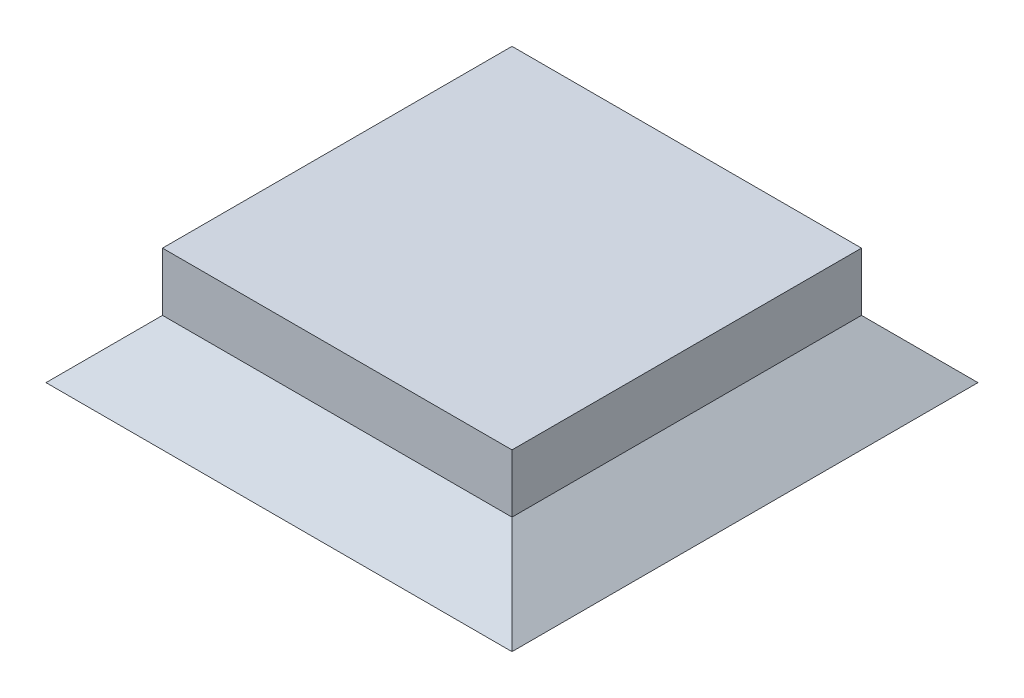
ISO-10303-21;
HEADER;
FILE_DESCRIPTION(('STEP AP214'),'2;1');
FILE_NAME('part.step','',(''),(''),'','','');
FILE_SCHEMA(('AUTOMOTIVE_DESIGN { 1 0 10303 214 1 1 1 1 }'));
ENDSEC;
DATA;
#1=APPLICATION_CONTEXT('core data for automotive mechanical design processes');
#2=APPLICATION_PROTOCOL_DEFINITION('international standard','automotive_design',2000,#1);
#3=PRODUCT_CONTEXT('',#1,'mechanical');
#4=PRODUCT('Part','Part','',(#3));
#5=PRODUCT_RELATED_PRODUCT_CATEGORY('part','',(#4));
#6=PRODUCT_DEFINITION_FORMATION('','',#4);
#7=PRODUCT_DEFINITION_CONTEXT('part definition',#1,'design');
#8=PRODUCT_DEFINITION('design','',#6,#7);
#9=PRODUCT_DEFINITION_SHAPE('','',#8);
#10=(LENGTH_UNIT() NAMED_UNIT(*) SI_UNIT(.MILLI.,.METRE.));
#11=(NAMED_UNIT(*) PLANE_ANGLE_UNIT() SI_UNIT($,.RADIAN.));
#12=(NAMED_UNIT(*) SI_UNIT($,.STERADIAN.) SOLID_ANGLE_UNIT());
#13=UNCERTAINTY_MEASURE_WITH_UNIT(LENGTH_MEASURE(1.E-05),#10,'distance_accuracy_value','');
#14=(GEOMETRIC_REPRESENTATION_CONTEXT(3) GLOBAL_UNCERTAINTY_ASSIGNED_CONTEXT((#13)) GLOBAL_UNIT_ASSIGNED_CONTEXT((#10,
#11,#12)) REPRESENTATION_CONTEXT('',''));
#15=CARTESIAN_POINT('',(0.,0.,0.));
#16=DIRECTION('',(0.,0.,1.));
#17=DIRECTION('',(1.,0.,0.));
#18=AXIS2_PLACEMENT_3D('',#15,#16,#17);
#19=CARTESIAN_POINT('',(3.,2.,-3.));
#20=DIRECTION('',(-1.,0.,0.));
#21=DIRECTION('',(0.,0.,1.));
#22=AXIS2_PLACEMENT_3D('',#19,#20,#21);
#23=PLANE('',#22);
#24=DIRECTION('',(0.,-1.,0.));
#25=VECTOR('',#24,1.);
#26=CARTESIAN_POINT('',(3.,2.,3.));
#27=LINE('',#26,#25);
#28=CARTESIAN_POINT('',(3.,2.,3.));
#29=VERTEX_POINT('',#28);
#30=CARTESIAN_POINT('',(3.,1.,3.));
#31=VERTEX_POINT('',#30);
#32=EDGE_CURVE('E134',#29,#31,#27,.T.);
#33=ORIENTED_EDGE('',*,*,#32,.T.);
#34=DIRECTION('',(0.,0.,-1.));
#35=VECTOR('',#34,1.);
#36=CARTESIAN_POINT('',(3.,1.,-3.));
#37=LINE('',#36,#35);
#38=CARTESIAN_POINT('',(3.,1.,-3.));
#39=VERTEX_POINT('',#38);
#40=EDGE_CURVE('E125',#31,#39,#37,.T.);
#41=ORIENTED_EDGE('',*,*,#40,.T.);
#42=DIRECTION('',(0.,-1.,0.));
#43=VECTOR('',#42,1.);
#44=CARTESIAN_POINT('',(3.,2.,-3.));
#45=LINE('',#44,#43);
#46=CARTESIAN_POINT('',(3.,2.,-3.));
#47=VERTEX_POINT('',#46);
#48=EDGE_CURVE('E47',#47,#39,#45,.T.);
#49=ORIENTED_EDGE('',*,*,#48,.F.);
#50=DIRECTION('',(0.,0.,-1.));
#51=VECTOR('',#50,1.);
#52=CARTESIAN_POINT('',(3.,2.,-3.));
#53=LINE('',#52,#51);
#54=EDGE_CURVE('E127',#29,#47,#53,.T.);
#55=ORIENTED_EDGE('',*,*,#54,.F.);
#56=EDGE_LOOP('',(#33,#41,#49,#55));
#57=FACE_BOUND('',#56,.T.);
#58=ADVANCED_FACE('F37',(#57),#23,.F.);
#59=CARTESIAN_POINT('',(-3.,2.,-3.));
#60=DIRECTION('',(0.,0.,1.));
#61=DIRECTION('',(1.,0.,0.));
#62=AXIS2_PLACEMENT_3D('',#59,#60,#61);
#63=PLANE('',#62);
#64=ORIENTED_EDGE('',*,*,#48,.T.);
#65=DIRECTION('',(-1.,0.,0.));
#66=VECTOR('',#65,1.);
#67=CARTESIAN_POINT('',(-3.,1.,-3.));
#68=LINE('',#67,#66);
#69=CARTESIAN_POINT('',(-3.,1.,-3.));
#70=VERTEX_POINT('',#69);
#71=EDGE_CURVE('E101',#39,#70,#68,.T.);
#72=ORIENTED_EDGE('',*,*,#71,.T.);
#73=DIRECTION('',(0.,-1.,0.));
#74=VECTOR('',#73,1.);
#75=CARTESIAN_POINT('',(-3.,2.,-3.));
#76=LINE('',#75,#74);
#77=CARTESIAN_POINT('',(-3.,2.,-3.));
#78=VERTEX_POINT('',#77);
#79=EDGE_CURVE('E138',#78,#70,#76,.T.);
#80=ORIENTED_EDGE('',*,*,#79,.F.);
#81=DIRECTION('',(-1.,0.,0.));
#82=VECTOR('',#81,1.);
#83=CARTESIAN_POINT('',(-3.,2.,-3.));
#84=LINE('',#83,#82);
#85=EDGE_CURVE('E129',#47,#78,#84,.T.);
#86=ORIENTED_EDGE('',*,*,#85,.F.);
#87=EDGE_LOOP('',(#64,#72,#80,#86));
#88=FACE_BOUND('',#87,.T.);
#89=ADVANCED_FACE('F153',(#88),#63,.F.);
#90=CARTESIAN_POINT('',(-3.,2.,-3.));
#91=DIRECTION('',(1.,0.,0.));
#92=DIRECTION('',(0.,0.,-1.));
#93=AXIS2_PLACEMENT_3D('',#90,#91,#92);
#94=PLANE('',#93);
#95=ORIENTED_EDGE('',*,*,#79,.T.);
#96=DIRECTION('',(0.,0.,1.));
#97=VECTOR('',#96,1.);
#98=CARTESIAN_POINT('',(-3.,1.,-3.));
#99=LINE('',#98,#97);
#100=CARTESIAN_POINT('',(-3.,1.,3.));
#101=VERTEX_POINT('',#100);
#102=EDGE_CURVE('E122',#70,#101,#99,.T.);
#103=ORIENTED_EDGE('',*,*,#102,.T.);
#104=DIRECTION('',(0.,-1.,0.));
#105=VECTOR('',#104,1.);
#106=CARTESIAN_POINT('',(-3.,2.,3.));
#107=LINE('',#106,#105);
#108=CARTESIAN_POINT('',(-3.,2.,3.));
#109=VERTEX_POINT('',#108);
#110=EDGE_CURVE('E136',#109,#101,#107,.T.);
#111=ORIENTED_EDGE('',*,*,#110,.F.);
#112=DIRECTION('',(0.,0.,1.));
#113=VECTOR('',#112,1.);
#114=CARTESIAN_POINT('',(-3.,2.,-3.));
#115=LINE('',#114,#113);
#116=EDGE_CURVE('E131',#78,#109,#115,.T.);
#117=ORIENTED_EDGE('',*,*,#116,.F.);
#118=EDGE_LOOP('',(#95,#103,#111,#117));
#119=FACE_BOUND('',#118,.T.);
#120=ADVANCED_FACE('F165',(#119),#94,.F.);
#121=CARTESIAN_POINT('',(-3.,2.,3.));
#122=DIRECTION('',(0.,0.,-1.));
#123=DIRECTION('',(-1.,0.,0.));
#124=AXIS2_PLACEMENT_3D('',#121,#122,#123);
#125=PLANE('',#124);
#126=ORIENTED_EDGE('',*,*,#110,.T.);
#127=DIRECTION('',(1.,0.,0.));
#128=VECTOR('',#127,1.);
#129=CARTESIAN_POINT('',(-3.,1.,3.));
#130=LINE('',#129,#128);
#131=EDGE_CURVE('E11',#101,#31,#130,.T.);
#132=ORIENTED_EDGE('',*,*,#131,.T.);
#133=ORIENTED_EDGE('',*,*,#32,.F.);
#134=DIRECTION('',(1.,0.,0.));
#135=VECTOR('',#134,1.);
#136=CARTESIAN_POINT('',(-3.,2.,3.));
#137=LINE('',#136,#135);
#138=EDGE_CURVE('E61',#109,#29,#137,.T.);
#139=ORIENTED_EDGE('',*,*,#138,.F.);
#140=EDGE_LOOP('',(#126,#132,#133,#139));
#141=FACE_BOUND('',#140,.T.);
#142=ADVANCED_FACE('F158',(#141),#125,.F.);
#143=CARTESIAN_POINT('',(0.,2.,0.));
#144=DIRECTION('',(0.,1.,0.));
#145=DIRECTION('',(0.,0.,1.));
#146=AXIS2_PLACEMENT_3D('',#143,#144,#145);
#147=PLANE('',#146);
#148=ORIENTED_EDGE('',*,*,#54,.T.);
#149=ORIENTED_EDGE('',*,*,#85,.T.);
#150=ORIENTED_EDGE('',*,*,#116,.T.);
#151=ORIENTED_EDGE('',*,*,#138,.T.);
#152=EDGE_LOOP('',(#148,#149,#150,#151));
#153=FACE_BOUND('',#152,.T.);
#154=ADVANCED_FACE('F156',(#153),#147,.T.);
#155=CARTESIAN_POINT('',(0.,0.,0.));
#156=DIRECTION('',(0.,1.,0.));
#157=DIRECTION('',(0.,0.,1.));
#158=AXIS2_PLACEMENT_3D('',#155,#156,#157);
#159=PLANE('',#158);
#160=DIRECTION('',(0.,0.,-1.));
#161=VECTOR('',#160,1.);
#162=CARTESIAN_POINT('',(4.,0.,-4.));
#163=LINE('',#162,#161);
#164=CARTESIAN_POINT('',(4.,0.,4.));
#165=VERTEX_POINT('',#164);
#166=CARTESIAN_POINT('',(4.,0.,-4.));
#167=VERTEX_POINT('',#166);
#168=EDGE_CURVE('E108',#165,#167,#163,.T.);
#169=ORIENTED_EDGE('',*,*,#168,.F.);
#170=DIRECTION('',(1.,0.,0.));
#171=VECTOR('',#170,1.);
#172=CARTESIAN_POINT('',(-4.,0.,4.));
#173=LINE('',#172,#171);
#174=CARTESIAN_POINT('',(-4.,0.,4.));
#175=VERTEX_POINT('',#174);
#176=EDGE_CURVE('E118',#175,#165,#173,.T.);
#177=ORIENTED_EDGE('',*,*,#176,.F.);
#178=DIRECTION('',(0.,0.,1.));
#179=VECTOR('',#178,1.);
#180=CARTESIAN_POINT('',(-4.,0.,-4.));
#181=LINE('',#180,#179);
#182=CARTESIAN_POINT('',(-4.,0.,-4.));
#183=VERTEX_POINT('',#182);
#184=EDGE_CURVE('E116',#183,#175,#181,.T.);
#185=ORIENTED_EDGE('',*,*,#184,.F.);
#186=DIRECTION('',(-1.,0.,0.));
#187=VECTOR('',#186,1.);
#188=CARTESIAN_POINT('',(-4.,0.,-4.));
#189=LINE('',#188,#187);
#190=EDGE_CURVE('E98',#167,#183,#189,.T.);
#191=ORIENTED_EDGE('',*,*,#190,.F.);
#192=EDGE_LOOP('',(#169,#177,#185,#191));
#193=FACE_BOUND('',#192,.T.);
#194=ADVANCED_FACE('F114',(#193),#159,.F.);
#195=CARTESIAN_POINT('',(0.,1.,3.));
#196=DIRECTION('',(0.,0.707106781186546,0.707106781186549));
#197=DIRECTION('',(-1.,0.,0.));
#198=AXIS2_PLACEMENT_3D('',#195,#196,#197);
#199=PLANE('',#198);
#200=DIRECTION('',(0.577350269189625,0.577350269189627,-0.577350269189625));
#201=VECTOR('',#200,1.);
#202=CARTESIAN_POINT('',(-2.,2.,2.));
#203=LINE('',#202,#201);
#204=EDGE_CURVE('E104',#175,#101,#203,.T.);
#205=ORIENTED_EDGE('',*,*,#204,.F.);
#206=ORIENTED_EDGE('',*,*,#176,.T.);
#207=DIRECTION('',(-0.577350269189625,0.577350269189627,-0.577350269189625));
#208=VECTOR('',#207,1.);
#209=CARTESIAN_POINT('',(2.,2.,2.));
#210=LINE('',#209,#208);
#211=EDGE_CURVE('E42',#31,#165,#210,.F.);
#212=ORIENTED_EDGE('',*,*,#211,.F.);
#213=ORIENTED_EDGE('',*,*,#131,.F.);
#214=EDGE_LOOP('',(#205,#206,#212,#213));
#215=FACE_BOUND('',#214,.T.);
#216=ADVANCED_FACE('F40',(#215),#199,.T.);
#217=CARTESIAN_POINT('',(3.,1.,0.));
#218=DIRECTION('',(0.707106781186549,0.707106781186546,0.));
#219=DIRECTION('',(0.,0.,1.));
#220=AXIS2_PLACEMENT_3D('',#217,#218,#219);
#221=PLANE('',#220);
#222=ORIENTED_EDGE('',*,*,#211,.T.);
#223=ORIENTED_EDGE('',*,*,#168,.T.);
#224=DIRECTION('',(-0.577350269189625,0.577350269189627,0.577350269189625));
#225=VECTOR('',#224,1.);
#226=CARTESIAN_POINT('',(2.,2.,-2.));
#227=LINE('',#226,#225);
#228=EDGE_CURVE('E94',#39,#167,#227,.F.);
#229=ORIENTED_EDGE('',*,*,#228,.F.);
#230=ORIENTED_EDGE('',*,*,#40,.F.);
#231=EDGE_LOOP('',(#222,#223,#229,#230));
#232=FACE_BOUND('',#231,.T.);
#233=ADVANCED_FACE('F109',(#232),#221,.T.);
#234=CARTESIAN_POINT('',(-3.,1.,0.));
#235=DIRECTION('',(-0.707106781186549,0.707106781186546,0.));
#236=DIRECTION('',(0.,0.,-1.));
#237=AXIS2_PLACEMENT_3D('',#234,#235,#236);
#238=PLANE('',#237);
#239=ORIENTED_EDGE('',*,*,#204,.T.);
#240=ORIENTED_EDGE('',*,*,#102,.F.);
#241=DIRECTION('',(-0.577350269189625,-0.577350269189627,-0.577350269189625));
#242=VECTOR('',#241,1.);
#243=CARTESIAN_POINT('',(-2.,2.,-2.));
#244=LINE('',#243,#242);
#245=EDGE_CURVE('E105',#183,#70,#244,.F.);
#246=ORIENTED_EDGE('',*,*,#245,.F.);
#247=ORIENTED_EDGE('',*,*,#184,.T.);
#248=EDGE_LOOP('',(#239,#240,#246,#247));
#249=FACE_BOUND('',#248,.T.);
#250=ADVANCED_FACE('F147',(#249),#238,.T.);
#251=CARTESIAN_POINT('',(0.,1.,-3.));
#252=DIRECTION('',(0.,0.707106781186546,-0.707106781186549));
#253=DIRECTION('',(1.,0.,0.));
#254=AXIS2_PLACEMENT_3D('',#251,#252,#253);
#255=PLANE('',#254);
#256=ORIENTED_EDGE('',*,*,#228,.T.);
#257=ORIENTED_EDGE('',*,*,#190,.T.);
#258=ORIENTED_EDGE('',*,*,#245,.T.);
#259=ORIENTED_EDGE('',*,*,#71,.F.);
#260=EDGE_LOOP('',(#256,#257,#258,#259));
#261=FACE_BOUND('',#260,.T.);
#262=ADVANCED_FACE('F96',(#261),#255,.T.);
#263=CLOSED_SHELL('',(#58,#89,#120,#142,#154,#194,#216,#233,#250,#262));
#264=MANIFOLD_SOLID_BREP('B2',#263);
#265=ADVANCED_BREP_SHAPE_REPRESENTATION('',(#18,#264),#14);
#266=SHAPE_DEFINITION_REPRESENTATION(#9,#265);
ENDSEC;
END-ISO-10303-21;
